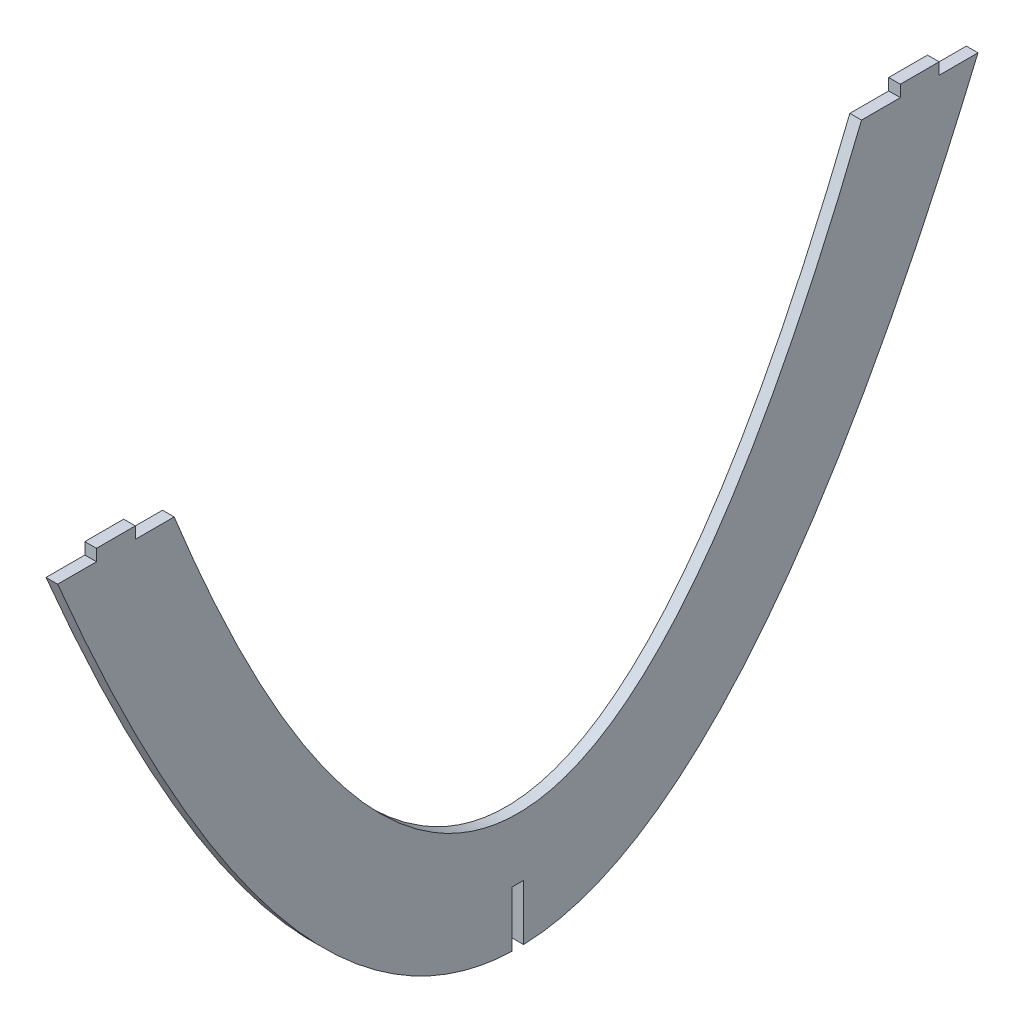
ISO-10303-21;
HEADER;
FILE_DESCRIPTION(('STEP AP214'),'2;1');
FILE_NAME('part.step','',(''),(''),'','','');
FILE_SCHEMA(('AUTOMOTIVE_DESIGN { 1 0 10303 214 1 1 1 1 }'));
ENDSEC;
DATA;
#1=APPLICATION_CONTEXT('core data for automotive mechanical design processes');
#2=APPLICATION_PROTOCOL_DEFINITION('international standard','automotive_design',2000,#1);
#3=PRODUCT_CONTEXT('',#1,'mechanical');
#4=PRODUCT('Part','Part','',(#3));
#5=PRODUCT_RELATED_PRODUCT_CATEGORY('part','',(#4));
#6=PRODUCT_DEFINITION_FORMATION('','',#4);
#7=PRODUCT_DEFINITION_CONTEXT('part definition',#1,'design');
#8=PRODUCT_DEFINITION('design','',#6,#7);
#9=PRODUCT_DEFINITION_SHAPE('','',#8);
#10=(LENGTH_UNIT() NAMED_UNIT(*) SI_UNIT(.MILLI.,.METRE.));
#11=(NAMED_UNIT(*) PLANE_ANGLE_UNIT() SI_UNIT($,.RADIAN.));
#12=(NAMED_UNIT(*) SI_UNIT($,.STERADIAN.) SOLID_ANGLE_UNIT());
#13=UNCERTAINTY_MEASURE_WITH_UNIT(LENGTH_MEASURE(1.E-05),#10,'distance_accuracy_value','');
#14=(GEOMETRIC_REPRESENTATION_CONTEXT(3) GLOBAL_UNCERTAINTY_ASSIGNED_CONTEXT((#13)) GLOBAL_UNIT_ASSIGNED_CONTEXT((#10,
#11,#12)) REPRESENTATION_CONTEXT('',''));
#15=CARTESIAN_POINT('',(0.,0.,0.));
#16=DIRECTION('',(0.,0.,1.));
#17=DIRECTION('',(1.,0.,0.));
#18=AXIS2_PLACEMENT_3D('',#15,#16,#17);
#19=CARTESIAN_POINT('',(3.,150.001171578109,118.491059400324));
#20=CARTESIAN_POINT('',(3.,-130.801451578029,3.37264938199411E-11));
#21=CARTESIAN_POINT('',(3.,150.001171577949,-118.491059400257));
#22=B_SPLINE_CURVE_WITH_KNOTS('',2,(#19,#20,#21),.UNSPECIFIED.,.F.,.F.,(3,3),
(0.0536987091974318,0.946301290802314),.UNSPECIFIED.);
#23=DIRECTION('',(-1.,0.,0.));
#24=VECTOR('',#23,1.);
#25=SURFACE_OF_LINEAR_EXTRUSION('',#22,#24);
#26=DIRECTION('',(-1.,0.,0.));
#27=VECTOR('',#26,1.);
#28=CARTESIAN_POINT('',(3.,9.62236000000021,1.50000000000671));
#29=LINE('',#28,#27);
#30=CARTESIAN_POINT('',(3.,9.62236000000021,1.50000000000671));
#31=VERTEX_POINT('',#30);
#32=CARTESIAN_POINT('',(0.,9.62236000000021,1.50000000000671));
#33=VERTEX_POINT('',#32);
#34=EDGE_CURVE('E180',#31,#33,#29,.T.);
#35=ORIENTED_EDGE('',*,*,#34,.F.);
#36=CARTESIAN_POINT('',(3.,150.001171578013,118.491059400284));
#37=VERTEX_POINT('',#36);
#38=EDGE_CURVE('E171',#37,#31,#22,.T.);
#39=ORIENTED_EDGE('',*,*,#38,.F.);
#40=DIRECTION('',(-1.,0.,0.));
#41=VECTOR('',#40,1.);
#42=CARTESIAN_POINT('',(3.,150.001171578013,118.491059400284));
#43=LINE('',#42,#41);
#44=CARTESIAN_POINT('',(0.,150.001171578013,118.491059400284));
#45=VERTEX_POINT('',#44);
#46=EDGE_CURVE('E46',#37,#45,#43,.T.);
#47=ORIENTED_EDGE('',*,*,#46,.T.);
#48=CARTESIAN_POINT('',(0.,150.001171578109,118.491059400324));
#49=CARTESIAN_POINT('',(0.,-130.801451578029,3.37264938199411E-11));
#50=CARTESIAN_POINT('',(0.,150.001171577949,-118.491059400257));
#51=B_SPLINE_CURVE_WITH_KNOTS('',2,(#48,#49,#50),.UNSPECIFIED.,.F.,.F.,(3,3),
(0.0536987091974318,0.946301290802314),.UNSPECIFIED.);
#52=EDGE_CURVE('E293',#45,#33,#51,.T.);
#53=ORIENTED_EDGE('',*,*,#52,.T.);
#54=EDGE_LOOP('',(#35,#39,#47,#53));
#55=FACE_BOUND('',#54,.T.);
#56=ADVANCED_FACE('F37',(#55),#25,.F.);
#57=CARTESIAN_POINT('',(3.,39.59986,3.91492394058446E-11));
#58=DIRECTION('',(-1.,0.,0.));
#59=DIRECTION('',(0.,0.,1.));
#60=AXIS2_PLACEMENT_3D('',#57,#58,#59);
#61=PLANE('',#60);
#62=DIRECTION('',(0.,-1.,0.));
#63=VECTOR('',#62,1.);
#64=CARTESIAN_POINT('',(3.,0.,1.50000000000672));
#65=LINE('',#64,#63);
#66=CARTESIAN_POINT('',(3.,23.9676670993181,1.50000000000672));
#67=VERTEX_POINT('',#66);
#68=EDGE_CURVE('E163',#67,#31,#65,.T.);
#69=ORIENTED_EDGE('',*,*,#68,.F.);
#70=DIRECTION('',(0.,0.,1.));
#71=VECTOR('',#70,1.);
#72=CARTESIAN_POINT('',(3.,23.9676670993181,0.));
#73=LINE('',#72,#71);
#74=CARTESIAN_POINT('',(3.,23.9676670993181,-1.49999999999328));
#75=VERTEX_POINT('',#74);
#76=EDGE_CURVE('E152',#75,#67,#73,.T.);
#77=ORIENTED_EDGE('',*,*,#76,.F.);
#78=DIRECTION('',(0.,-1.,0.));
#79=VECTOR('',#78,1.);
#80=CARTESIAN_POINT('',(3.,0.,-1.49999999999328));
#81=LINE('',#80,#79);
#82=CARTESIAN_POINT('',(3.,9.62235999999981,-1.49999999999329));
#83=VERTEX_POINT('',#82);
#84=EDGE_CURVE('E162',#75,#83,#81,.T.);
#85=ORIENTED_EDGE('',*,*,#84,.T.);
#86=CARTESIAN_POINT('',(3.,150.001171577949,-118.491059400257));
#87=VERTEX_POINT('',#86);
#88=EDGE_CURVE('E253',#83,#87,#22,.T.);
#89=ORIENTED_EDGE('',*,*,#88,.T.);
#90=DIRECTION('',(0.,0.,1.));
#91=VECTOR('',#90,1.);
#92=CARTESIAN_POINT('',(3.,150.001171578013,-88.4915279689343));
#93=LINE('',#92,#91);
#94=CARTESIAN_POINT('',(3.,150.001171578013,-108.491293684596));
#95=VERTEX_POINT('',#94);
#96=EDGE_CURVE('E259',#87,#95,#93,.T.);
#97=ORIENTED_EDGE('',*,*,#96,.T.);
#98=DIRECTION('',(0.,-1.,0.));
#99=VECTOR('',#98,1.);
#100=CARTESIAN_POINT('',(3.,153.001171578013,-108.491293684596));
#101=LINE('',#100,#99);
#102=CARTESIAN_POINT('',(3.,153.001171578013,-108.491293684596));
#103=VERTEX_POINT('',#102);
#104=EDGE_CURVE('E231',#103,#95,#101,.T.);
#105=ORIENTED_EDGE('',*,*,#104,.F.);
#106=DIRECTION('',(0.,0.,-1.));
#107=VECTOR('',#106,1.);
#108=CARTESIAN_POINT('',(3.,153.001171578013,1.38180703972666E-13));
#109=LINE('',#108,#107);
#110=CARTESIAN_POINT('',(3.,153.001171578013,-98.4912936845956));
#111=VERTEX_POINT('',#110);
#112=EDGE_CURVE('E220',#111,#103,#109,.T.);
#113=ORIENTED_EDGE('',*,*,#112,.F.);
#114=DIRECTION('',(0.,-1.,0.));
#115=VECTOR('',#114,1.);
#116=CARTESIAN_POINT('',(3.,153.001171578013,-98.4912936845956));
#117=LINE('',#116,#115);
#118=CARTESIAN_POINT('',(3.,150.001171578013,-98.4912936845956));
#119=VERTEX_POINT('',#118);
#120=EDGE_CURVE('E234',#111,#119,#117,.T.);
#121=ORIENTED_EDGE('',*,*,#120,.T.);
#122=CARTESIAN_POINT('',(3.,150.001171578013,-88.4915279689343));
#123=VERTEX_POINT('',#122);
#124=EDGE_CURVE('E258',#119,#123,#93,.T.);
#125=ORIENTED_EDGE('',*,*,#124,.T.);
#126=CARTESIAN_POINT('',(3.,150.001171578069,-88.4915279689567));
#127=CARTESIAN_POINT('',(3.,-70.8014515781657,3.91457699588926E-11));
#128=CARTESIAN_POINT('',(3.,150.001171578263,88.491527969035));
#129=B_SPLINE_CURVE_WITH_KNOTS('',2,(#126,#127,#128),.UNSPECIFIED.,.F.,.F.,(3,3),
(0.163916291636479,0.836083708363224),.UNSPECIFIED.);
#130=CARTESIAN_POINT('',(3.,150.001171578013,88.4915279689348));
#131=VERTEX_POINT('',#130);
#132=EDGE_CURVE('E240',#123,#131,#129,.T.);
#133=ORIENTED_EDGE('',*,*,#132,.T.);
#134=DIRECTION('',(0.,0.,1.));
#135=VECTOR('',#134,1.);
#136=CARTESIAN_POINT('',(3.,150.001171578013,118.491059400284));
#137=LINE('',#136,#135);
#138=CARTESIAN_POINT('',(3.,150.001171578013,98.4912936846095));
#139=VERTEX_POINT('',#138);
#140=EDGE_CURVE('E247',#131,#139,#137,.T.);
#141=ORIENTED_EDGE('',*,*,#140,.T.);
#142=DIRECTION('',(0.,-1.,0.));
#143=VECTOR('',#142,1.);
#144=CARTESIAN_POINT('',(3.,153.001171578013,98.4912936846095));
#145=LINE('',#144,#143);
#146=CARTESIAN_POINT('',(3.,153.001171578013,98.4912936846095));
#147=VERTEX_POINT('',#146);
#148=EDGE_CURVE('E209',#147,#139,#145,.T.);
#149=ORIENTED_EDGE('',*,*,#148,.F.);
#150=DIRECTION('',(0.,0.,-1.));
#151=VECTOR('',#150,1.);
#152=CARTESIAN_POINT('',(3.,153.001171578013,1.38180703972666E-13));
#153=LINE('',#152,#151);
#154=CARTESIAN_POINT('',(3.,153.001171578013,108.491293684609));
#155=VERTEX_POINT('',#154);
#156=EDGE_CURVE('E187',#155,#147,#153,.T.);
#157=ORIENTED_EDGE('',*,*,#156,.F.);
#158=DIRECTION('',(0.,-1.,0.));
#159=VECTOR('',#158,1.);
#160=CARTESIAN_POINT('',(3.,153.001171578013,108.491293684609));
#161=LINE('',#160,#159);
#162=CARTESIAN_POINT('',(3.,150.001171578013,108.491293684609));
#163=VERTEX_POINT('',#162);
#164=EDGE_CURVE('E198',#155,#163,#161,.T.);
#165=ORIENTED_EDGE('',*,*,#164,.T.);
#166=EDGE_CURVE('E61',#163,#37,#137,.T.);
#167=ORIENTED_EDGE('',*,*,#166,.T.);
#168=ORIENTED_EDGE('',*,*,#38,.T.);
#169=EDGE_LOOP('',(#69,#77,#85,#89,#97,#105,#113,#121,#125,#133,#141,#149,#157,#165,#167,#168));
#170=FACE_BOUND('',#169,.T.);
#171=ADVANCED_FACE('F169',(#170),#61,.F.);
#172=CARTESIAN_POINT('',(0.,39.59986,3.91492394058446E-11));
#173=DIRECTION('',(-1.,0.,0.));
#174=DIRECTION('',(0.,0.,1.));
#175=AXIS2_PLACEMENT_3D('',#172,#173,#174);
#176=PLANE('',#175);
#177=DIRECTION('',(0.,0.,1.));
#178=VECTOR('',#177,1.);
#179=CARTESIAN_POINT('',(0.,23.9676670993181,0.));
#180=LINE('',#179,#178);
#181=CARTESIAN_POINT('',(0.,23.9676670993181,-1.49999999999328));
#182=VERTEX_POINT('',#181);
#183=CARTESIAN_POINT('',(0.,23.9676670993181,1.50000000000672));
#184=VERTEX_POINT('',#183);
#185=EDGE_CURVE('E174',#182,#184,#180,.T.);
#186=ORIENTED_EDGE('',*,*,#185,.T.);
#187=DIRECTION('',(0.,-1.,0.));
#188=VECTOR('',#187,1.);
#189=CARTESIAN_POINT('',(0.,0.,1.50000000000672));
#190=LINE('',#189,#188);
#191=EDGE_CURVE('E53',#184,#33,#190,.T.);
#192=ORIENTED_EDGE('',*,*,#191,.T.);
#193=ORIENTED_EDGE('',*,*,#52,.F.);
#194=DIRECTION('',(0.,0.,1.));
#195=VECTOR('',#194,1.);
#196=CARTESIAN_POINT('',(0.,150.001171578013,118.491059400284));
#197=LINE('',#196,#195);
#198=CARTESIAN_POINT('',(0.,150.001171578013,108.491293684609));
#199=VERTEX_POINT('',#198);
#200=EDGE_CURVE('E344',#199,#45,#197,.T.);
#201=ORIENTED_EDGE('',*,*,#200,.F.);
#202=DIRECTION('',(0.,-1.,0.));
#203=VECTOR('',#202,1.);
#204=CARTESIAN_POINT('',(0.,153.001171578013,108.491293684609));
#205=LINE('',#204,#203);
#206=CARTESIAN_POINT('',(0.,153.001171578013,108.491293684609));
#207=VERTEX_POINT('',#206);
#208=EDGE_CURVE('E203',#207,#199,#205,.T.);
#209=ORIENTED_EDGE('',*,*,#208,.F.);
#210=DIRECTION('',(0.,0.,1.));
#211=VECTOR('',#210,1.);
#212=CARTESIAN_POINT('',(0.,153.001171578013,1.38180703972666E-13));
#213=LINE('',#212,#211);
#214=CARTESIAN_POINT('',(0.,153.001171578013,98.4912936846095));
#215=VERTEX_POINT('',#214);
#216=EDGE_CURVE('E193',#215,#207,#213,.T.);
#217=ORIENTED_EDGE('',*,*,#216,.F.);
#218=DIRECTION('',(0.,-1.,0.));
#219=VECTOR('',#218,1.);
#220=CARTESIAN_POINT('',(0.,153.001171578013,98.4912936846095));
#221=LINE('',#220,#219);
#222=CARTESIAN_POINT('',(0.,150.001171578013,98.4912936846095));
#223=VERTEX_POINT('',#222);
#224=EDGE_CURVE('E206',#215,#223,#221,.T.);
#225=ORIENTED_EDGE('',*,*,#224,.T.);
#226=CARTESIAN_POINT('',(0.,150.001171578013,88.4915279689348));
#227=VERTEX_POINT('',#226);
#228=EDGE_CURVE('E345',#227,#223,#197,.T.);
#229=ORIENTED_EDGE('',*,*,#228,.F.);
#230=CARTESIAN_POINT('',(0.,150.001171578069,-88.4915279689567));
#231=CARTESIAN_POINT('',(0.,-70.8014515781657,3.91457699588926E-11));
#232=CARTESIAN_POINT('',(0.,150.001171578263,88.491527969035));
#233=B_SPLINE_CURVE_WITH_KNOTS('',2,(#230,#231,#232),.UNSPECIFIED.,.F.,.F.,(3,3),
(0.163916291636479,0.836083708363224),.UNSPECIFIED.);
#234=CARTESIAN_POINT('',(0.,150.001171578013,-88.4915279689343));
#235=VERTEX_POINT('',#234);
#236=EDGE_CURVE('E239',#235,#227,#233,.T.);
#237=ORIENTED_EDGE('',*,*,#236,.F.);
#238=DIRECTION('',(0.,0.,1.));
#239=VECTOR('',#238,1.);
#240=CARTESIAN_POINT('',(0.,150.001171578013,-88.4915279689343));
#241=LINE('',#240,#239);
#242=CARTESIAN_POINT('',(0.,150.001171578013,-98.4912936845956));
#243=VERTEX_POINT('',#242);
#244=EDGE_CURVE('E324',#243,#235,#241,.T.);
#245=ORIENTED_EDGE('',*,*,#244,.F.);
#246=DIRECTION('',(0.,-1.,0.));
#247=VECTOR('',#246,1.);
#248=CARTESIAN_POINT('',(0.,153.001171578013,-98.4912936845956));
#249=LINE('',#248,#247);
#250=CARTESIAN_POINT('',(0.,153.001171578013,-98.4912936845956));
#251=VERTEX_POINT('',#250);
#252=EDGE_CURVE('E237',#251,#243,#249,.T.);
#253=ORIENTED_EDGE('',*,*,#252,.F.);
#254=DIRECTION('',(0.,0.,-1.));
#255=VECTOR('',#254,1.);
#256=CARTESIAN_POINT('',(0.,153.001171578013,1.38180703972666E-13));
#257=LINE('',#256,#255);
#258=CARTESIAN_POINT('',(0.,153.001171578013,-108.491293684596));
#259=VERTEX_POINT('',#258);
#260=EDGE_CURVE('E213',#251,#259,#257,.T.);
#261=ORIENTED_EDGE('',*,*,#260,.T.);
#262=DIRECTION('',(0.,-1.,0.));
#263=VECTOR('',#262,1.);
#264=CARTESIAN_POINT('',(0.,153.001171578013,-108.491293684596));
#265=LINE('',#264,#263);
#266=CARTESIAN_POINT('',(0.,150.001171578013,-108.491293684596));
#267=VERTEX_POINT('',#266);
#268=EDGE_CURVE('E224',#259,#267,#265,.T.);
#269=ORIENTED_EDGE('',*,*,#268,.T.);
#270=CARTESIAN_POINT('',(0.,150.001171577949,-118.491059400257));
#271=VERTEX_POINT('',#270);
#272=EDGE_CURVE('E246',#271,#267,#241,.T.);
#273=ORIENTED_EDGE('',*,*,#272,.F.);
#274=CARTESIAN_POINT('',(0.,9.62235999999981,-1.49999999999329));
#275=VERTEX_POINT('',#274);
#276=EDGE_CURVE('E298',#275,#271,#51,.T.);
#277=ORIENTED_EDGE('',*,*,#276,.F.);
#278=DIRECTION('',(0.,-1.,0.));
#279=VECTOR('',#278,1.);
#280=CARTESIAN_POINT('',(0.,0.,-1.49999999999328));
#281=LINE('',#280,#279);
#282=EDGE_CURVE('E172',#182,#275,#281,.T.);
#283=ORIENTED_EDGE('',*,*,#282,.F.);
#284=EDGE_LOOP('',(#186,#192,#193,#201,#209,#217,#225,#229,#237,#245,#253,#261,#269,#273,#277,#283));
#285=FACE_BOUND('',#284,.T.);
#286=ADVANCED_FACE('F281',(#285),#176,.T.);
#287=CARTESIAN_POINT('',(3.,150.001171578013,118.491059400284));
#288=DIRECTION('',(0.,-1.,0.));
#289=DIRECTION('',(0.,0.,-1.));
#290=AXIS2_PLACEMENT_3D('',#287,#288,#289);
#291=PLANE('',#290);
#292=DIRECTION('',(-1.,0.,0.));
#293=VECTOR('',#292,1.);
#294=CARTESIAN_POINT('',(0.,150.001171578013,98.4912936846095));
#295=LINE('',#294,#293);
#296=EDGE_CURVE('E182',#139,#223,#295,.T.);
#297=ORIENTED_EDGE('',*,*,#296,.F.);
#298=ORIENTED_EDGE('',*,*,#140,.F.);
#299=DIRECTION('',(-1.,0.,0.));
#300=VECTOR('',#299,1.);
#301=CARTESIAN_POINT('',(3.,150.001171578013,88.4915279689348));
#302=LINE('',#301,#300);
#303=EDGE_CURVE('E11',#131,#227,#302,.T.);
#304=ORIENTED_EDGE('',*,*,#303,.T.);
#305=ORIENTED_EDGE('',*,*,#228,.T.);
#306=EDGE_LOOP('',(#297,#298,#304,#305));
#307=FACE_BOUND('',#306,.T.);
#308=ADVANCED_FACE('F273',(#307),#291,.F.);
#309=CARTESIAN_POINT('',(3.,150.001171578013,-88.4915279689343));
#310=DIRECTION('',(0.,-1.,0.));
#311=DIRECTION('',(0.,0.,-1.));
#312=AXIS2_PLACEMENT_3D('',#309,#310,#311);
#313=PLANE('',#312);
#314=DIRECTION('',(-1.,0.,0.));
#315=VECTOR('',#314,1.);
#316=CARTESIAN_POINT('',(5.018730509167E-13,150.001171578013,-108.491293684596));
#317=LINE('',#316,#315);
#318=EDGE_CURVE('E217',#95,#267,#317,.T.);
#319=ORIENTED_EDGE('',*,*,#318,.F.);
#320=ORIENTED_EDGE('',*,*,#96,.F.);
#321=DIRECTION('',(-1.,0.,0.));
#322=VECTOR('',#321,1.);
#323=CARTESIAN_POINT('',(3.,150.001171577949,-118.491059400257));
#324=LINE('',#323,#322);
#325=EDGE_CURVE('E304',#87,#271,#324,.T.);
#326=ORIENTED_EDGE('',*,*,#325,.T.);
#327=ORIENTED_EDGE('',*,*,#272,.T.);
#328=EDGE_LOOP('',(#319,#320,#326,#327));
#329=FACE_BOUND('',#328,.T.);
#330=ADVANCED_FACE('F278',(#329),#313,.F.);
#331=DIRECTION('',(-1.,0.,0.));
#332=VECTOR('',#331,1.);
#333=SURFACE_OF_LINEAR_EXTRUSION('',#129,#332);
#334=ORIENTED_EDGE('',*,*,#236,.T.);
#335=ORIENTED_EDGE('',*,*,#303,.F.);
#336=ORIENTED_EDGE('',*,*,#132,.F.);
#337=DIRECTION('',(-1.,0.,0.));
#338=VECTOR('',#337,1.);
#339=CARTESIAN_POINT('',(3.,150.001171578013,-88.4915279689343));
#340=LINE('',#339,#338);
#341=EDGE_CURVE('E311',#123,#235,#340,.T.);
#342=ORIENTED_EDGE('',*,*,#341,.T.);
#343=EDGE_LOOP('',(#334,#335,#336,#342));
#344=FACE_BOUND('',#343,.T.);
#345=ADVANCED_FACE('F39',(#344),#333,.F.);
#346=ORIENTED_EDGE('',*,*,#166,.F.);
#347=DIRECTION('',(-1.,0.,0.));
#348=VECTOR('',#347,1.);
#349=CARTESIAN_POINT('',(0.,150.001171578013,108.491293684609));
#350=LINE('',#349,#348);
#351=EDGE_CURVE('E191',#163,#199,#350,.T.);
#352=ORIENTED_EDGE('',*,*,#351,.T.);
#353=ORIENTED_EDGE('',*,*,#200,.T.);
#354=ORIENTED_EDGE('',*,*,#46,.F.);
#355=EDGE_LOOP('',(#346,#352,#353,#354));
#356=FACE_BOUND('',#355,.T.);
#357=ADVANCED_FACE('F269',(#356),#291,.F.);
#358=ORIENTED_EDGE('',*,*,#88,.F.);
#359=DIRECTION('',(-1.,0.,0.));
#360=VECTOR('',#359,1.);
#361=CARTESIAN_POINT('',(3.,9.62235999999981,-1.49999999999329));
#362=LINE('',#361,#360);
#363=EDGE_CURVE('E183',#83,#275,#362,.T.);
#364=ORIENTED_EDGE('',*,*,#363,.T.);
#365=ORIENTED_EDGE('',*,*,#276,.T.);
#366=ORIENTED_EDGE('',*,*,#325,.F.);
#367=EDGE_LOOP('',(#358,#364,#365,#366));
#368=FACE_BOUND('',#367,.T.);
#369=ADVANCED_FACE('F265',(#368),#25,.F.);
#370=ORIENTED_EDGE('',*,*,#124,.F.);
#371=DIRECTION('',(-1.,0.,0.));
#372=VECTOR('',#371,1.);
#373=CARTESIAN_POINT('',(-4.55613758223985E-13,150.001171578013,-98.4912936845956));
#374=LINE('',#373,#372);
#375=EDGE_CURVE('E212',#119,#243,#374,.T.);
#376=ORIENTED_EDGE('',*,*,#375,.T.);
#377=ORIENTED_EDGE('',*,*,#244,.T.);
#378=ORIENTED_EDGE('',*,*,#341,.F.);
#379=EDGE_LOOP('',(#370,#376,#377,#378));
#380=FACE_BOUND('',#379,.T.);
#381=ADVANCED_FACE('F268',(#380),#313,.F.);
#382=CARTESIAN_POINT('',(-4.55613758223985E-13,153.001171578013,-98.4912936845956));
#383=DIRECTION('',(0.,0.,1.));
#384=DIRECTION('',(1.,0.,0.));
#385=AXIS2_PLACEMENT_3D('',#382,#383,#384);
#386=PLANE('',#385);
#387=ORIENTED_EDGE('',*,*,#375,.F.);
#388=ORIENTED_EDGE('',*,*,#120,.F.);
#389=DIRECTION('',(-1.,0.,0.));
#390=VECTOR('',#389,1.);
#391=CARTESIAN_POINT('',(-4.55613758223985E-13,153.001171578013,-98.4912936845956));
#392=LINE('',#391,#390);
#393=EDGE_CURVE('E216',#111,#251,#392,.T.);
#394=ORIENTED_EDGE('',*,*,#393,.T.);
#395=ORIENTED_EDGE('',*,*,#252,.T.);
#396=EDGE_LOOP('',(#387,#388,#394,#395));
#397=FACE_BOUND('',#396,.T.);
#398=ADVANCED_FACE('F322',(#397),#386,.T.);
#399=CARTESIAN_POINT('',(5.018730509167E-13,153.001171578013,-108.491293684596));
#400=DIRECTION('',(0.,0.,1.));
#401=DIRECTION('',(1.,0.,0.));
#402=AXIS2_PLACEMENT_3D('',#399,#400,#401);
#403=PLANE('',#402);
#404=ORIENTED_EDGE('',*,*,#318,.T.);
#405=ORIENTED_EDGE('',*,*,#268,.F.);
#406=DIRECTION('',(-1.,0.,0.));
#407=VECTOR('',#406,1.);
#408=CARTESIAN_POINT('',(5.018730509167E-13,153.001171578013,-108.491293684596));
#409=LINE('',#408,#407);
#410=EDGE_CURVE('E222',#103,#259,#409,.T.);
#411=ORIENTED_EDGE('',*,*,#410,.F.);
#412=ORIENTED_EDGE('',*,*,#104,.T.);
#413=EDGE_LOOP('',(#404,#405,#411,#412));
#414=FACE_BOUND('',#413,.T.);
#415=ADVANCED_FACE('F313',(#414),#403,.F.);
#416=CARTESIAN_POINT('',(0.,153.001171578013,1.38180703972666E-13));
#417=DIRECTION('',(0.,1.,0.));
#418=DIRECTION('',(0.,0.,1.));
#419=AXIS2_PLACEMENT_3D('',#416,#417,#418);
#420=PLANE('',#419);
#421=ORIENTED_EDGE('',*,*,#260,.F.);
#422=ORIENTED_EDGE('',*,*,#393,.F.);
#423=ORIENTED_EDGE('',*,*,#112,.T.);
#424=ORIENTED_EDGE('',*,*,#410,.T.);
#425=EDGE_LOOP('',(#421,#422,#423,#424));
#426=FACE_BOUND('',#425,.T.);
#427=ADVANCED_FACE('F317',(#426),#420,.T.);
#428=CARTESIAN_POINT('',(0.,153.001171578013,98.4912936846095));
#429=DIRECTION('',(0.,0.,1.));
#430=DIRECTION('',(0.,-1.,0.));
#431=AXIS2_PLACEMENT_3D('',#428,#429,#430);
#432=PLANE('',#431);
#433=ORIENTED_EDGE('',*,*,#296,.T.);
#434=ORIENTED_EDGE('',*,*,#224,.F.);
#435=DIRECTION('',(-1.,0.,0.));
#436=VECTOR('',#435,1.);
#437=CARTESIAN_POINT('',(0.,153.001171578013,98.4912936846095));
#438=LINE('',#437,#436);
#439=EDGE_CURVE('E190',#147,#215,#438,.T.);
#440=ORIENTED_EDGE('',*,*,#439,.F.);
#441=ORIENTED_EDGE('',*,*,#148,.T.);
#442=EDGE_LOOP('',(#433,#434,#440,#441));
#443=FACE_BOUND('',#442,.T.);
#444=ADVANCED_FACE('F334',(#443),#432,.F.);
#445=CARTESIAN_POINT('',(0.,153.001171578013,108.491293684609));
#446=DIRECTION('',(0.,0.,1.));
#447=DIRECTION('',(0.,-1.,0.));
#448=AXIS2_PLACEMENT_3D('',#445,#446,#447);
#449=PLANE('',#448);
#450=ORIENTED_EDGE('',*,*,#351,.F.);
#451=ORIENTED_EDGE('',*,*,#164,.F.);
#452=DIRECTION('',(-1.,0.,0.));
#453=VECTOR('',#452,1.);
#454=CARTESIAN_POINT('',(0.,153.001171578013,108.491293684609));
#455=LINE('',#454,#453);
#456=EDGE_CURVE('E195',#155,#207,#455,.T.);
#457=ORIENTED_EDGE('',*,*,#456,.T.);
#458=ORIENTED_EDGE('',*,*,#208,.T.);
#459=EDGE_LOOP('',(#450,#451,#457,#458));
#460=FACE_BOUND('',#459,.T.);
#461=ADVANCED_FACE('F342',(#460),#449,.T.);
#462=CARTESIAN_POINT('',(0.,153.001171578013,1.38180703972666E-13));
#463=DIRECTION('',(0.,1.,0.));
#464=DIRECTION('',(0.,0.,1.));
#465=AXIS2_PLACEMENT_3D('',#462,#463,#464);
#466=PLANE('',#465);
#467=ORIENTED_EDGE('',*,*,#156,.T.);
#468=ORIENTED_EDGE('',*,*,#439,.T.);
#469=ORIENTED_EDGE('',*,*,#216,.T.);
#470=ORIENTED_EDGE('',*,*,#456,.F.);
#471=EDGE_LOOP('',(#467,#468,#469,#470));
#472=FACE_BOUND('',#471,.T.);
#473=ADVANCED_FACE('F339',(#472),#466,.T.);
#474=CARTESIAN_POINT('',(3.,0.,1.50000000000672));
#475=DIRECTION('',(0.,0.,-1.));
#476=DIRECTION('',(-1.,0.,0.));
#477=AXIS2_PLACEMENT_3D('',#474,#475,#476);
#478=PLANE('',#477);
#479=ORIENTED_EDGE('',*,*,#191,.F.);
#480=DIRECTION('',(-1.,0.,0.));
#481=VECTOR('',#480,1.);
#482=CARTESIAN_POINT('',(3.,23.9676670993181,1.50000000000672));
#483=LINE('',#482,#481);
#484=EDGE_CURVE('E155',#67,#184,#483,.T.);
#485=ORIENTED_EDGE('',*,*,#484,.F.);
#486=ORIENTED_EDGE('',*,*,#68,.T.);
#487=ORIENTED_EDGE('',*,*,#34,.T.);
#488=EDGE_LOOP('',(#479,#485,#486,#487));
#489=FACE_BOUND('',#488,.T.);
#490=ADVANCED_FACE('F165',(#489),#478,.T.);
#491=CARTESIAN_POINT('',(3.,0.,-1.49999999999328));
#492=DIRECTION('',(0.,0.,-1.));
#493=DIRECTION('',(-1.,0.,0.));
#494=AXIS2_PLACEMENT_3D('',#491,#492,#493);
#495=PLANE('',#494);
#496=ORIENTED_EDGE('',*,*,#282,.T.);
#497=ORIENTED_EDGE('',*,*,#363,.F.);
#498=ORIENTED_EDGE('',*,*,#84,.F.);
#499=DIRECTION('',(-1.,0.,0.));
#500=VECTOR('',#499,1.);
#501=CARTESIAN_POINT('',(3.,23.9676670993181,-1.49999999999328));
#502=LINE('',#501,#500);
#503=EDGE_CURVE('E157',#75,#182,#502,.T.);
#504=ORIENTED_EDGE('',*,*,#503,.T.);
#505=EDGE_LOOP('',(#496,#497,#498,#504));
#506=FACE_BOUND('',#505,.T.);
#507=ADVANCED_FACE('F300',(#506),#495,.F.);
#508=CARTESIAN_POINT('',(3.,23.9676670993181,0.));
#509=DIRECTION('',(0.,-1.,0.));
#510=DIRECTION('',(0.,0.,-1.));
#511=AXIS2_PLACEMENT_3D('',#508,#509,#510);
#512=PLANE('',#511);
#513=ORIENTED_EDGE('',*,*,#185,.F.);
#514=ORIENTED_EDGE('',*,*,#503,.F.);
#515=ORIENTED_EDGE('',*,*,#76,.T.);
#516=ORIENTED_EDGE('',*,*,#484,.T.);
#517=EDGE_LOOP('',(#513,#514,#515,#516));
#518=FACE_BOUND('',#517,.T.);
#519=ADVANCED_FACE('F154',(#518),#512,.T.);
#520=CLOSED_SHELL('',(#56,#171,#286,#308,#330,#345,#357,#369,#381,#398,#415,#427,#444,#461,#473,
#490,#507,#519));
#521=MANIFOLD_SOLID_BREP('B2',#520);
#522=ADVANCED_BREP_SHAPE_REPRESENTATION('',(#18,#521),#14);
#523=SHAPE_DEFINITION_REPRESENTATION(#9,#522);
ENDSEC;
END-ISO-10303-21;
